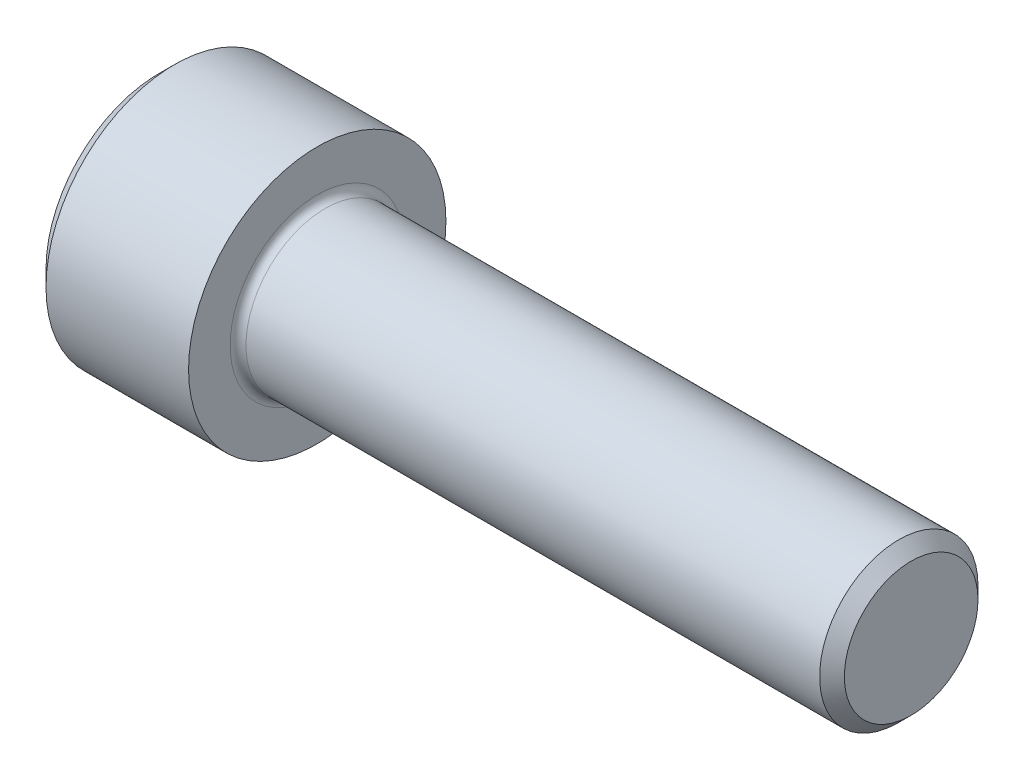
ISO-10303-21;
HEADER;
FILE_DESCRIPTION(('STEP AP214'),'2;1');
FILE_NAME('part.step','',(''),(''),'','','');
FILE_SCHEMA(('AUTOMOTIVE_DESIGN { 1 0 10303 214 1 1 1 1 }'));
ENDSEC;
DATA;
#1=APPLICATION_CONTEXT('core data for automotive mechanical design processes');
#2=APPLICATION_PROTOCOL_DEFINITION('international standard','automotive_design',2000,#1);
#3=PRODUCT_CONTEXT('',#1,'mechanical');
#4=PRODUCT('Part','Part','',(#3));
#5=PRODUCT_RELATED_PRODUCT_CATEGORY('part','',(#4));
#6=PRODUCT_DEFINITION_FORMATION('','',#4);
#7=PRODUCT_DEFINITION_CONTEXT('part definition',#1,'design');
#8=PRODUCT_DEFINITION('design','',#6,#7);
#9=PRODUCT_DEFINITION_SHAPE('','',#8);
#10=(LENGTH_UNIT() NAMED_UNIT(*) SI_UNIT(.MILLI.,.METRE.));
#11=(NAMED_UNIT(*) PLANE_ANGLE_UNIT() SI_UNIT($,.RADIAN.));
#12=(NAMED_UNIT(*) SI_UNIT($,.STERADIAN.) SOLID_ANGLE_UNIT());
#13=UNCERTAINTY_MEASURE_WITH_UNIT(LENGTH_MEASURE(1.E-05),#10,'distance_accuracy_value','');
#14=(GEOMETRIC_REPRESENTATION_CONTEXT(3) GLOBAL_UNCERTAINTY_ASSIGNED_CONTEXT((#13)) GLOBAL_UNIT_ASSIGNED_CONTEXT((#10,
#11,#12)) REPRESENTATION_CONTEXT('',''));
#15=CARTESIAN_POINT('',(0.,0.,0.));
#16=DIRECTION('',(0.,0.,1.));
#17=DIRECTION('',(1.,0.,0.));
#18=AXIS2_PLACEMENT_3D('',#15,#16,#17);
#19=CARTESIAN_POINT('',(0.,0.,0.));
#20=DIRECTION('',(-1.,0.,0.));
#21=DIRECTION('',(0.,0.,1.));
#22=AXIS2_PLACEMENT_3D('',#19,#20,#21);
#23=PLANE('',#22);
#24=CARTESIAN_POINT('',(0.,0.,0.));
#25=DIRECTION('',(-1.,0.,0.));
#26=DIRECTION('',(0.,0.,1.));
#27=AXIS2_PLACEMENT_3D('',#24,#25,#26);
#28=CIRCLE('',#27,5.69999999999999);
#29=CARTESIAN_POINT('',(0.,0.,5.69999999999999));
#30=VERTEX_POINT('',#29);
#31=EDGE_CURVE('E188',#30,#30,#28,.T.);
#32=ORIENTED_EDGE('',*,*,#31,.T.);
#33=EDGE_LOOP('',(#32));
#34=FACE_BOUND('',#33,.T.);
#35=DIRECTION('',(0.,-0.5,-0.866025403784439));
#36=VECTOR('',#35,1.);
#37=CARTESIAN_POINT('',(0.,3.46410161513775,0.));
#38=LINE('',#37,#36);
#39=CARTESIAN_POINT('',(0.,3.46410161513775,0.));
#40=VERTEX_POINT('',#39);
#41=CARTESIAN_POINT('',(0.,1.73205080756888,-3.));
#42=VERTEX_POINT('',#41);
#43=EDGE_CURVE('E155',#40,#42,#38,.T.);
#44=ORIENTED_EDGE('',*,*,#43,.F.);
#45=DIRECTION('',(0.,0.5,-0.866025403784439));
#46=VECTOR('',#45,1.);
#47=CARTESIAN_POINT('',(0.,1.73205080756888,3.));
#48=LINE('',#47,#46);
#49=CARTESIAN_POINT('',(0.,1.73205080756888,3.));
#50=VERTEX_POINT('',#49);
#51=EDGE_CURVE('E153',#50,#40,#48,.T.);
#52=ORIENTED_EDGE('',*,*,#51,.F.);
#53=DIRECTION('',(0.,1.,0.));
#54=VECTOR('',#53,1.);
#55=CARTESIAN_POINT('',(0.,-1.73205080756888,3.));
#56=LINE('',#55,#54);
#57=CARTESIAN_POINT('',(0.,-1.73205080756888,3.));
#58=VERTEX_POINT('',#57);
#59=EDGE_CURVE('E151',#58,#50,#56,.T.);
#60=ORIENTED_EDGE('',*,*,#59,.F.);
#61=DIRECTION('',(0.,0.5,0.866025403784439));
#62=VECTOR('',#61,1.);
#63=CARTESIAN_POINT('',(0.,-3.46410161513775,0.));
#64=LINE('',#63,#62);
#65=CARTESIAN_POINT('',(0.,-3.46410161513775,0.));
#66=VERTEX_POINT('',#65);
#67=EDGE_CURVE('E149',#66,#58,#64,.T.);
#68=ORIENTED_EDGE('',*,*,#67,.F.);
#69=DIRECTION('',(0.,-0.5,0.866025403784439));
#70=VECTOR('',#69,1.);
#71=CARTESIAN_POINT('',(0.,-1.73205080756888,-3.));
#72=LINE('',#71,#70);
#73=CARTESIAN_POINT('',(0.,-1.73205080756888,-3.));
#74=VERTEX_POINT('',#73);
#75=EDGE_CURVE('E122',#74,#66,#72,.T.);
#76=ORIENTED_EDGE('',*,*,#75,.F.);
#77=DIRECTION('',(0.,-1.,0.));
#78=VECTOR('',#77,1.);
#79=CARTESIAN_POINT('',(0.,1.73205080756888,-3.));
#80=LINE('',#79,#78);
#81=EDGE_CURVE('E115',#42,#74,#80,.T.);
#82=ORIENTED_EDGE('',*,*,#81,.F.);
#83=EDGE_LOOP('',(#44,#52,#60,#68,#76,#82));
#84=FACE_BOUND('',#83,.T.);
#85=ADVANCED_FACE('F33',(#34,#84),#23,.T.);
#86=CARTESIAN_POINT('',(38.,0.,0.));
#87=DIRECTION('',(1.,0.,0.));
#88=DIRECTION('',(0.,0.,-1.));
#89=AXIS2_PLACEMENT_3D('',#86,#87,#88);
#90=CYLINDRICAL_SURFACE('',#89,6.5);
#91=CARTESIAN_POINT('',(0.800000000000002,0.,0.));
#92=DIRECTION('',(-1.,0.,0.));
#93=DIRECTION('',(0.,0.,1.));
#94=AXIS2_PLACEMENT_3D('',#91,#92,#93);
#95=CIRCLE('',#94,6.5);
#96=CARTESIAN_POINT('',(0.800000000000002,0.,6.5));
#97=VERTEX_POINT('',#96);
#98=EDGE_CURVE('E185',#97,#97,#95,.F.);
#99=ORIENTED_EDGE('',*,*,#98,.T.);
#100=EDGE_LOOP('',(#99));
#101=FACE_BOUND('',#100,.T.);
#102=CARTESIAN_POINT('',(8.,0.,0.));
#103=DIRECTION('',(1.,0.,0.));
#104=DIRECTION('',(0.,0.,-1.));
#105=AXIS2_PLACEMENT_3D('',#102,#103,#104);
#106=CIRCLE('',#105,6.5);
#107=CARTESIAN_POINT('',(8.,0.,-6.5));
#108=VERTEX_POINT('',#107);
#109=EDGE_CURVE('E175',#108,#108,#106,.T.);
#110=ORIENTED_EDGE('',*,*,#109,.F.);
#111=EDGE_LOOP('',(#110));
#112=FACE_BOUND('',#111,.T.);
#113=ADVANCED_FACE('F206',(#101,#112),#90,.T.);
#114=CARTESIAN_POINT('',(8.,0.,-6.5));
#115=DIRECTION('',(1.,0.,0.));
#116=DIRECTION('',(0.,0.,-1.));
#117=AXIS2_PLACEMENT_3D('',#114,#115,#116);
#118=PLANE('',#117);
#119=CARTESIAN_POINT('',(8.,0.,0.));
#120=DIRECTION('',(1.,0.,0.));
#121=DIRECTION('',(0.,0.,-1.));
#122=AXIS2_PLACEMENT_3D('',#119,#120,#121);
#123=CIRCLE('',#122,4.4);
#124=CARTESIAN_POINT('',(8.,0.,-4.4));
#125=VERTEX_POINT('',#124);
#126=EDGE_CURVE('E11',#125,#125,#123,.F.);
#127=ORIENTED_EDGE('',*,*,#126,.T.);
#128=EDGE_LOOP('',(#127));
#129=FACE_BOUND('',#128,.T.);
#130=ORIENTED_EDGE('',*,*,#109,.T.);
#131=EDGE_LOOP('',(#130));
#132=FACE_BOUND('',#131,.T.);
#133=ADVANCED_FACE('F212',(#129,#132),#118,.T.);
#134=CARTESIAN_POINT('',(38.,0.,0.));
#135=DIRECTION('',(1.,0.,0.));
#136=DIRECTION('',(0.,0.,-1.));
#137=AXIS2_PLACEMENT_3D('',#134,#135,#136);
#138=CYLINDRICAL_SURFACE('',#137,4.);
#139=CARTESIAN_POINT('',(8.4,0.,0.));
#140=DIRECTION('',(1.,0.,0.));
#141=DIRECTION('',(0.,0.,-1.));
#142=AXIS2_PLACEMENT_3D('',#139,#140,#141);
#143=CIRCLE('',#142,4.);
#144=CARTESIAN_POINT('',(8.4,0.,-4.));
#145=VERTEX_POINT('',#144);
#146=EDGE_CURVE('E41',#145,#145,#143,.T.);
#147=ORIENTED_EDGE('',*,*,#146,.T.);
#148=EDGE_LOOP('',(#147));
#149=FACE_BOUND('',#148,.T.);
#150=CARTESIAN_POINT('',(37.375,0.,0.));
#151=DIRECTION('',(1.,0.,0.));
#152=DIRECTION('',(0.,0.,-1.));
#153=AXIS2_PLACEMENT_3D('',#150,#151,#152);
#154=CIRCLE('',#153,4.);
#155=CARTESIAN_POINT('',(37.375,0.,-4.));
#156=VERTEX_POINT('',#155);
#157=EDGE_CURVE('E182',#156,#156,#154,.F.);
#158=ORIENTED_EDGE('',*,*,#157,.T.);
#159=EDGE_LOOP('',(#158));
#160=FACE_BOUND('',#159,.T.);
#161=ADVANCED_FACE('F193',(#149,#160),#138,.T.);
#162=CARTESIAN_POINT('',(38.,0.,-4.));
#163=DIRECTION('',(1.,0.,0.));
#164=DIRECTION('',(0.,0.,-1.));
#165=AXIS2_PLACEMENT_3D('',#162,#163,#164);
#166=PLANE('',#165);
#167=CARTESIAN_POINT('',(38.,0.,0.));
#168=DIRECTION('',(1.,0.,0.));
#169=DIRECTION('',(0.,0.,-1.));
#170=AXIS2_PLACEMENT_3D('',#167,#168,#169);
#171=CIRCLE('',#170,3.37499999999999);
#172=CARTESIAN_POINT('',(38.,0.,-3.37499999999999));
#173=VERTEX_POINT('',#172);
#174=EDGE_CURVE('E179',#173,#173,#171,.T.);
#175=ORIENTED_EDGE('',*,*,#174,.T.);
#176=EDGE_LOOP('',(#175));
#177=FACE_BOUND('',#176,.T.);
#178=ADVANCED_FACE('F220',(#177),#166,.T.);
#179=CARTESIAN_POINT('',(38.,0.,0.));
#180=DIRECTION('',(-1.,0.,0.));
#181=DIRECTION('',(0.,0.,1.));
#182=AXIS2_PLACEMENT_3D('',#179,#180,#181);
#183=CONICAL_SURFACE('',#182,3.37499999999999,0.785398163397457);
#184=ORIENTED_EDGE('',*,*,#157,.F.);
#185=EDGE_LOOP('',(#184));
#186=FACE_BOUND('',#185,.T.);
#187=ORIENTED_EDGE('',*,*,#174,.F.);
#188=EDGE_LOOP('',(#187));
#189=FACE_BOUND('',#188,.T.);
#190=ADVANCED_FACE('F218',(#186,#189),#183,.T.);
#191=CARTESIAN_POINT('',(4.,-1.73205080756888,-3.));
#192=DIRECTION('',(0.,-0.866025403784439,-0.5));
#193=DIRECTION('',(0.,0.5,-0.866025403784439));
#194=AXIS2_PLACEMENT_3D('',#191,#192,#193);
#195=PLANE('',#194);
#196=DIRECTION('',(0.,-0.5,0.866025403784439));
#197=VECTOR('',#196,1.);
#198=CARTESIAN_POINT('',(4.,-1.73205080756888,-3.));
#199=LINE('',#198,#197);
#200=CARTESIAN_POINT('',(4.,-1.73205080756888,-3.));
#201=VERTEX_POINT('',#200);
#202=CARTESIAN_POINT('',(4.,-2.59807621135332,-1.5));
#203=VERTEX_POINT('',#202);
#204=EDGE_CURVE('E114',#201,#203,#199,.T.);
#205=ORIENTED_EDGE('',*,*,#204,.F.);
#206=DIRECTION('',(-1.,0.,0.));
#207=VECTOR('',#206,1.);
#208=CARTESIAN_POINT('',(4.,-1.73205080756888,-3.));
#209=LINE('',#208,#207);
#210=EDGE_CURVE('E158',#201,#74,#209,.T.);
#211=ORIENTED_EDGE('',*,*,#210,.T.);
#212=ORIENTED_EDGE('',*,*,#75,.T.);
#213=DIRECTION('',(-1.,0.,0.));
#214=VECTOR('',#213,1.);
#215=CARTESIAN_POINT('',(4.,-3.46410161513775,0.));
#216=LINE('',#215,#214);
#217=CARTESIAN_POINT('',(4.,-3.46410161513775,0.));
#218=VERTEX_POINT('',#217);
#219=EDGE_CURVE('E118',#218,#66,#216,.T.);
#220=ORIENTED_EDGE('',*,*,#219,.F.);
#221=EDGE_CURVE('E104',#203,#218,#199,.T.);
#222=ORIENTED_EDGE('',*,*,#221,.F.);
#223=EDGE_LOOP('',(#205,#211,#212,#220,#222));
#224=FACE_BOUND('',#223,.T.);
#225=ADVANCED_FACE('F119',(#224),#195,.F.);
#226=CARTESIAN_POINT('',(4.,1.73205080756888,-3.));
#227=DIRECTION('',(0.,0.,-1.));
#228=DIRECTION('',(-1.,0.,0.));
#229=AXIS2_PLACEMENT_3D('',#226,#227,#228);
#230=PLANE('',#229);
#231=DIRECTION('',(0.,-1.,0.));
#232=VECTOR('',#231,1.);
#233=CARTESIAN_POINT('',(4.,1.73205080756888,-3.));
#234=LINE('',#233,#232);
#235=CARTESIAN_POINT('',(4.,1.73205080756888,-3.));
#236=VERTEX_POINT('',#235);
#237=CARTESIAN_POINT('',(4.,0.,-3.));
#238=VERTEX_POINT('',#237);
#239=EDGE_CURVE('E127',#236,#238,#234,.T.);
#240=ORIENTED_EDGE('',*,*,#239,.F.);
#241=DIRECTION('',(-1.,0.,0.));
#242=VECTOR('',#241,1.);
#243=CARTESIAN_POINT('',(4.,1.73205080756888,-3.));
#244=LINE('',#243,#242);
#245=EDGE_CURVE('E161',#236,#42,#244,.T.);
#246=ORIENTED_EDGE('',*,*,#245,.T.);
#247=ORIENTED_EDGE('',*,*,#81,.T.);
#248=ORIENTED_EDGE('',*,*,#210,.F.);
#249=EDGE_CURVE('E145',#238,#201,#234,.T.);
#250=ORIENTED_EDGE('',*,*,#249,.F.);
#251=EDGE_LOOP('',(#240,#246,#247,#248,#250));
#252=FACE_BOUND('',#251,.T.);
#253=ADVANCED_FACE('F226',(#252),#230,.F.);
#254=CARTESIAN_POINT('',(4.,3.46410161513775,0.));
#255=DIRECTION('',(0.,0.866025403784439,-0.5));
#256=DIRECTION('',(0.,0.5,0.866025403784439));
#257=AXIS2_PLACEMENT_3D('',#254,#255,#256);
#258=PLANE('',#257);
#259=DIRECTION('',(0.,-0.5,-0.866025403784439));
#260=VECTOR('',#259,1.);
#261=CARTESIAN_POINT('',(4.,3.46410161513775,0.));
#262=LINE('',#261,#260);
#263=CARTESIAN_POINT('',(4.,3.46410161513775,0.));
#264=VERTEX_POINT('',#263);
#265=CARTESIAN_POINT('',(4.,2.59807621135332,-1.5));
#266=VERTEX_POINT('',#265);
#267=EDGE_CURVE('E142',#264,#266,#262,.T.);
#268=ORIENTED_EDGE('',*,*,#267,.F.);
#269=DIRECTION('',(-1.,0.,0.));
#270=VECTOR('',#269,1.);
#271=CARTESIAN_POINT('',(4.,3.46410161513775,0.));
#272=LINE('',#271,#270);
#273=EDGE_CURVE('E164',#264,#40,#272,.T.);
#274=ORIENTED_EDGE('',*,*,#273,.T.);
#275=ORIENTED_EDGE('',*,*,#43,.T.);
#276=ORIENTED_EDGE('',*,*,#245,.F.);
#277=EDGE_CURVE('E141',#266,#236,#262,.T.);
#278=ORIENTED_EDGE('',*,*,#277,.F.);
#279=EDGE_LOOP('',(#268,#274,#275,#276,#278));
#280=FACE_BOUND('',#279,.T.);
#281=ADVANCED_FACE('F254',(#280),#258,.F.);
#282=CARTESIAN_POINT('',(4.,1.73205080756888,3.));
#283=DIRECTION('',(0.,0.866025403784439,0.5));
#284=DIRECTION('',(0.,-0.5,0.866025403784439));
#285=AXIS2_PLACEMENT_3D('',#282,#283,#284);
#286=PLANE('',#285);
#287=DIRECTION('',(0.,0.5,-0.866025403784439));
#288=VECTOR('',#287,1.);
#289=CARTESIAN_POINT('',(4.,1.73205080756888,3.));
#290=LINE('',#289,#288);
#291=CARTESIAN_POINT('',(4.,1.73205080756888,3.));
#292=VERTEX_POINT('',#291);
#293=CARTESIAN_POINT('',(4.,2.59807621135332,1.5));
#294=VERTEX_POINT('',#293);
#295=EDGE_CURVE('E138',#292,#294,#290,.T.);
#296=ORIENTED_EDGE('',*,*,#295,.F.);
#297=DIRECTION('',(-1.,0.,0.));
#298=VECTOR('',#297,1.);
#299=CARTESIAN_POINT('',(4.,1.73205080756888,3.));
#300=LINE('',#299,#298);
#301=EDGE_CURVE('E167',#292,#50,#300,.T.);
#302=ORIENTED_EDGE('',*,*,#301,.T.);
#303=ORIENTED_EDGE('',*,*,#51,.T.);
#304=ORIENTED_EDGE('',*,*,#273,.F.);
#305=EDGE_CURVE('E137',#294,#264,#290,.T.);
#306=ORIENTED_EDGE('',*,*,#305,.F.);
#307=EDGE_LOOP('',(#296,#302,#303,#304,#306));
#308=FACE_BOUND('',#307,.T.);
#309=ADVANCED_FACE('F250',(#308),#286,.F.);
#310=CARTESIAN_POINT('',(4.,-1.73205080756888,3.));
#311=DIRECTION('',(0.,0.,1.));
#312=DIRECTION('',(0.,-1.,0.));
#313=AXIS2_PLACEMENT_3D('',#310,#311,#312);
#314=PLANE('',#313);
#315=DIRECTION('',(0.,1.,0.));
#316=VECTOR('',#315,1.);
#317=CARTESIAN_POINT('',(4.,-1.73205080756888,3.));
#318=LINE('',#317,#316);
#319=CARTESIAN_POINT('',(4.,-1.73205080756888,3.));
#320=VERTEX_POINT('',#319);
#321=CARTESIAN_POINT('',(4.,0.,3.));
#322=VERTEX_POINT('',#321);
#323=EDGE_CURVE('E48',#320,#322,#318,.T.);
#324=ORIENTED_EDGE('',*,*,#323,.F.);
#325=DIRECTION('',(-1.,0.,0.));
#326=VECTOR('',#325,1.);
#327=CARTESIAN_POINT('',(4.,-1.73205080756888,3.));
#328=LINE('',#327,#326);
#329=EDGE_CURVE('E126',#320,#58,#328,.T.);
#330=ORIENTED_EDGE('',*,*,#329,.T.);
#331=ORIENTED_EDGE('',*,*,#59,.T.);
#332=ORIENTED_EDGE('',*,*,#301,.F.);
#333=EDGE_CURVE('E133',#322,#292,#318,.T.);
#334=ORIENTED_EDGE('',*,*,#333,.F.);
#335=EDGE_LOOP('',(#324,#330,#331,#332,#334));
#336=FACE_BOUND('',#335,.T.);
#337=ADVANCED_FACE('F247',(#336),#314,.F.);
#338=CARTESIAN_POINT('',(4.,-3.46410161513775,0.));
#339=DIRECTION('',(0.,-0.866025403784439,0.5));
#340=DIRECTION('',(0.,-0.5,-0.866025403784439));
#341=AXIS2_PLACEMENT_3D('',#338,#339,#340);
#342=PLANE('',#341);
#343=DIRECTION('',(0.,0.5,0.866025403784439));
#344=VECTOR('',#343,1.);
#345=CARTESIAN_POINT('',(4.,-3.46410161513775,0.));
#346=LINE('',#345,#344);
#347=CARTESIAN_POINT('',(4.,-2.59807621135332,1.5));
#348=VERTEX_POINT('',#347);
#349=EDGE_CURVE('E108',#218,#348,#346,.T.);
#350=ORIENTED_EDGE('',*,*,#349,.F.);
#351=ORIENTED_EDGE('',*,*,#219,.T.);
#352=ORIENTED_EDGE('',*,*,#67,.T.);
#353=ORIENTED_EDGE('',*,*,#329,.F.);
#354=EDGE_CURVE('E132',#348,#320,#346,.T.);
#355=ORIENTED_EDGE('',*,*,#354,.F.);
#356=EDGE_LOOP('',(#350,#351,#352,#353,#355));
#357=FACE_BOUND('',#356,.T.);
#358=ADVANCED_FACE('F130',(#357),#342,.F.);
#359=CARTESIAN_POINT('',(4.,0.,0.));
#360=DIRECTION('',(-1.,0.,0.));
#361=DIRECTION('',(0.,0.,1.));
#362=AXIS2_PLACEMENT_3D('',#359,#360,#361);
#363=PLANE('',#362);
#364=ORIENTED_EDGE('',*,*,#333,.T.);
#365=ORIENTED_EDGE('',*,*,#295,.T.);
#366=CARTESIAN_POINT('',(4.,0.,0.));
#367=DIRECTION('',(-1.,0.,0.));
#368=DIRECTION('',(0.,0.,1.));
#369=AXIS2_PLACEMENT_3D('',#366,#367,#368);
#370=CIRCLE('',#369,3.);
#371=EDGE_CURVE('E172',#322,#294,#370,.T.);
#372=ORIENTED_EDGE('',*,*,#371,.F.);
#373=EDGE_LOOP('',(#364,#365,#372));
#374=FACE_BOUND('',#373,.T.);
#375=ADVANCED_FACE('F246',(#374),#363,.T.);
#376=ORIENTED_EDGE('',*,*,#305,.T.);
#377=ORIENTED_EDGE('',*,*,#267,.T.);
#378=EDGE_CURVE('E176',#294,#266,#370,.T.);
#379=ORIENTED_EDGE('',*,*,#378,.F.);
#380=EDGE_LOOP('',(#376,#377,#379));
#381=FACE_BOUND('',#380,.T.);
#382=ADVANCED_FACE('F268',(#381),#363,.T.);
#383=ORIENTED_EDGE('',*,*,#277,.T.);
#384=ORIENTED_EDGE('',*,*,#239,.T.);
#385=EDGE_CURVE('E285',#266,#238,#370,.T.);
#386=ORIENTED_EDGE('',*,*,#385,.F.);
#387=EDGE_LOOP('',(#383,#384,#386));
#388=FACE_BOUND('',#387,.T.);
#389=ADVANCED_FACE('F273',(#388),#363,.T.);
#390=ORIENTED_EDGE('',*,*,#249,.T.);
#391=ORIENTED_EDGE('',*,*,#204,.T.);
#392=EDGE_CURVE('E286',#238,#203,#370,.T.);
#393=ORIENTED_EDGE('',*,*,#392,.F.);
#394=EDGE_LOOP('',(#390,#391,#393));
#395=FACE_BOUND('',#394,.T.);
#396=ADVANCED_FACE('F266',(#395),#363,.T.);
#397=ORIENTED_EDGE('',*,*,#221,.T.);
#398=ORIENTED_EDGE('',*,*,#349,.T.);
#399=EDGE_CURVE('E110',#203,#348,#370,.T.);
#400=ORIENTED_EDGE('',*,*,#399,.F.);
#401=EDGE_LOOP('',(#397,#398,#400));
#402=FACE_BOUND('',#401,.T.);
#403=ADVANCED_FACE('F106',(#402),#363,.T.);
#404=ORIENTED_EDGE('',*,*,#354,.T.);
#405=ORIENTED_EDGE('',*,*,#323,.T.);
#406=EDGE_CURVE('E160',#348,#322,#370,.T.);
#407=ORIENTED_EDGE('',*,*,#406,.F.);
#408=EDGE_LOOP('',(#404,#405,#407));
#409=FACE_BOUND('',#408,.T.);
#410=ADVANCED_FACE('F241',(#409),#363,.T.);
#411=CARTESIAN_POINT('',(5.7320508075689,0.,0.));
#412=DIRECTION('',(-1.,0.,0.));
#413=DIRECTION('',(0.,0.,1.));
#414=AXIS2_PLACEMENT_3D('',#411,#412,#413);
#415=CONICAL_SURFACE('',#414,0.,1.04719755119659);
#416=ORIENTED_EDGE('',*,*,#371,.T.);
#417=ORIENTED_EDGE('',*,*,#378,.T.);
#418=ORIENTED_EDGE('',*,*,#385,.T.);
#419=ORIENTED_EDGE('',*,*,#392,.T.);
#420=ORIENTED_EDGE('',*,*,#399,.T.);
#421=ORIENTED_EDGE('',*,*,#406,.T.);
#422=EDGE_LOOP('',(#416,#417,#418,#419,#420,#421));
#423=FACE_BOUND('',#422,.T.);
#424=CARTESIAN_POINT('',(5.7320508075689,0.,0.));
#425=VERTEX_POINT('',#424);
#426=VERTEX_LOOP('',#425);
#427=FACE_BOUND('',#426,.T.);
#428=ADVANCED_FACE('F202',(#423,#427),#415,.F.);
#429=CARTESIAN_POINT('',(0.800000000000002,0.,0.));
#430=DIRECTION('',(1.,0.,0.));
#431=DIRECTION('',(0.,0.,-1.));
#432=AXIS2_PLACEMENT_3D('',#429,#430,#431);
#433=CONICAL_SURFACE('',#432,6.5,0.78539816339745);
#434=ORIENTED_EDGE('',*,*,#31,.F.);
#435=EDGE_LOOP('',(#434));
#436=FACE_BOUND('',#435,.T.);
#437=ORIENTED_EDGE('',*,*,#98,.F.);
#438=EDGE_LOOP('',(#437));
#439=FACE_BOUND('',#438,.T.);
#440=ADVANCED_FACE('F197',(#436,#439),#433,.T.);
#441=CARTESIAN_POINT('',(8.4,0.,0.));
#442=DIRECTION('',(1.,0.,0.));
#443=DIRECTION('',(0.,0.,-1.));
#444=AXIS2_PLACEMENT_3D('',#441,#442,#443);
#445=TOROIDAL_SURFACE('',#444,4.4,0.4);
#446=ORIENTED_EDGE('',*,*,#126,.F.);
#447=EDGE_LOOP('',(#446));
#448=FACE_BOUND('',#447,.T.);
#449=ORIENTED_EDGE('',*,*,#146,.F.);
#450=EDGE_LOOP('',(#449));
#451=FACE_BOUND('',#450,.T.);
#452=ADVANCED_FACE('F35',(#448,#451),#445,.F.);
#453=CLOSED_SHELL('',(#85,#113,#133,#161,#178,#190,#225,#253,#281,#309,#337,#358,#375,#382,#389,
#396,#403,#410,#428,#440,#452));
#454=MANIFOLD_SOLID_BREP('B2',#453);
#455=ADVANCED_BREP_SHAPE_REPRESENTATION('',(#18,#454),#14);
#456=SHAPE_DEFINITION_REPRESENTATION(#9,#455);
ENDSEC;
END-ISO-10303-21;
